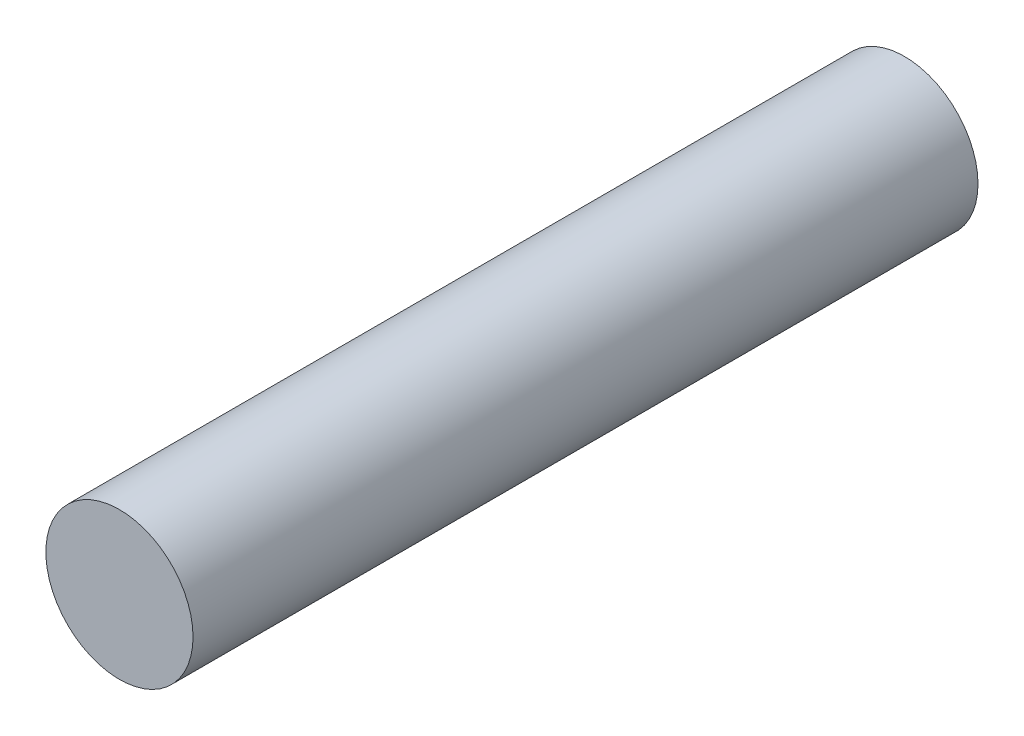
ISO-10303-21;
HEADER;
FILE_DESCRIPTION(('STEP AP214'),'2;1');
FILE_NAME('part.step','',(''),(''),'','','');
FILE_SCHEMA(('AUTOMOTIVE_DESIGN { 1 0 10303 214 1 1 1 1 }'));
ENDSEC;
DATA;
#1=APPLICATION_CONTEXT('core data for automotive mechanical design processes');
#2=APPLICATION_PROTOCOL_DEFINITION('international standard','automotive_design',2000,#1);
#3=PRODUCT_CONTEXT('',#1,'mechanical');
#4=PRODUCT('Part','Part','',(#3));
#5=PRODUCT_RELATED_PRODUCT_CATEGORY('part','',(#4));
#6=PRODUCT_DEFINITION_FORMATION('','',#4);
#7=PRODUCT_DEFINITION_CONTEXT('part definition',#1,'design');
#8=PRODUCT_DEFINITION('design','',#6,#7);
#9=PRODUCT_DEFINITION_SHAPE('','',#8);
#10=(LENGTH_UNIT() NAMED_UNIT(*) SI_UNIT(.MILLI.,.METRE.));
#11=(NAMED_UNIT(*) PLANE_ANGLE_UNIT() SI_UNIT($,.RADIAN.));
#12=(NAMED_UNIT(*) SI_UNIT($,.STERADIAN.) SOLID_ANGLE_UNIT());
#13=UNCERTAINTY_MEASURE_WITH_UNIT(LENGTH_MEASURE(1.E-05),#10,'distance_accuracy_value','');
#14=(GEOMETRIC_REPRESENTATION_CONTEXT(3) GLOBAL_UNCERTAINTY_ASSIGNED_CONTEXT((#13)) GLOBAL_UNIT_ASSIGNED_CONTEXT((#10,
#11,#12)) REPRESENTATION_CONTEXT('',''));
#15=CARTESIAN_POINT('',(0.,0.,0.));
#16=DIRECTION('',(0.,0.,1.));
#17=DIRECTION('',(1.,0.,0.));
#18=AXIS2_PLACEMENT_3D('',#15,#16,#17);
#19=CARTESIAN_POINT('',(0.,0.,-40.));
#20=DIRECTION('',(0.,0.,1.));
#21=DIRECTION('',(1.,0.,0.));
#22=AXIS2_PLACEMENT_3D('',#19,#20,#21);
#23=CYLINDRICAL_SURFACE('',#22,7.5);
#24=CARTESIAN_POINT('',(0.,0.,-40.));
#25=DIRECTION('',(0.,0.,1.));
#26=DIRECTION('',(1.,0.,0.));
#27=AXIS2_PLACEMENT_3D('',#24,#25,#26);
#28=CIRCLE('',#27,7.5);
#29=CARTESIAN_POINT('',(7.5,0.,-40.));
#30=VERTEX_POINT('',#29);
#31=EDGE_CURVE('E10',#30,#30,#28,.T.);
#32=ORIENTED_EDGE('',*,*,#31,.T.);
#33=EDGE_LOOP('',(#32));
#34=FACE_BOUND('',#33,.T.);
#35=CARTESIAN_POINT('',(0.,0.,40.));
#36=DIRECTION('',(0.,0.,1.));
#37=DIRECTION('',(1.,0.,0.));
#38=AXIS2_PLACEMENT_3D('',#35,#36,#37);
#39=CIRCLE('',#38,7.5);
#40=CARTESIAN_POINT('',(7.5,0.,40.));
#41=VERTEX_POINT('',#40);
#42=EDGE_CURVE('E42',#41,#41,#39,.T.);
#43=ORIENTED_EDGE('',*,*,#42,.F.);
#44=EDGE_LOOP('',(#43));
#45=FACE_BOUND('',#44,.T.);
#46=ADVANCED_FACE('F36',(#34,#45),#23,.T.);
#47=CARTESIAN_POINT('',(0.,0.,-40.));
#48=DIRECTION('',(0.,0.,1.));
#49=DIRECTION('',(1.,0.,0.));
#50=AXIS2_PLACEMENT_3D('',#47,#48,#49);
#51=PLANE('',#50);
#52=ORIENTED_EDGE('',*,*,#31,.F.);
#53=EDGE_LOOP('',(#52));
#54=FACE_BOUND('',#53,.T.);
#55=ADVANCED_FACE('F51',(#54),#51,.F.);
#56=CARTESIAN_POINT('',(0.,0.,40.));
#57=DIRECTION('',(0.,0.,1.));
#58=DIRECTION('',(1.,0.,0.));
#59=AXIS2_PLACEMENT_3D('',#56,#57,#58);
#60=PLANE('',#59);
#61=ORIENTED_EDGE('',*,*,#42,.T.);
#62=EDGE_LOOP('',(#61));
#63=FACE_BOUND('',#62,.T.);
#64=ADVANCED_FACE('F48',(#63),#60,.T.);
#65=CLOSED_SHELL('',(#46,#55,#64));
#66=MANIFOLD_SOLID_BREP('B2',#65);
#67=ADVANCED_BREP_SHAPE_REPRESENTATION('',(#18,#66),#14);
#68=SHAPE_DEFINITION_REPRESENTATION(#9,#67);
ENDSEC;
END-ISO-10303-21;
